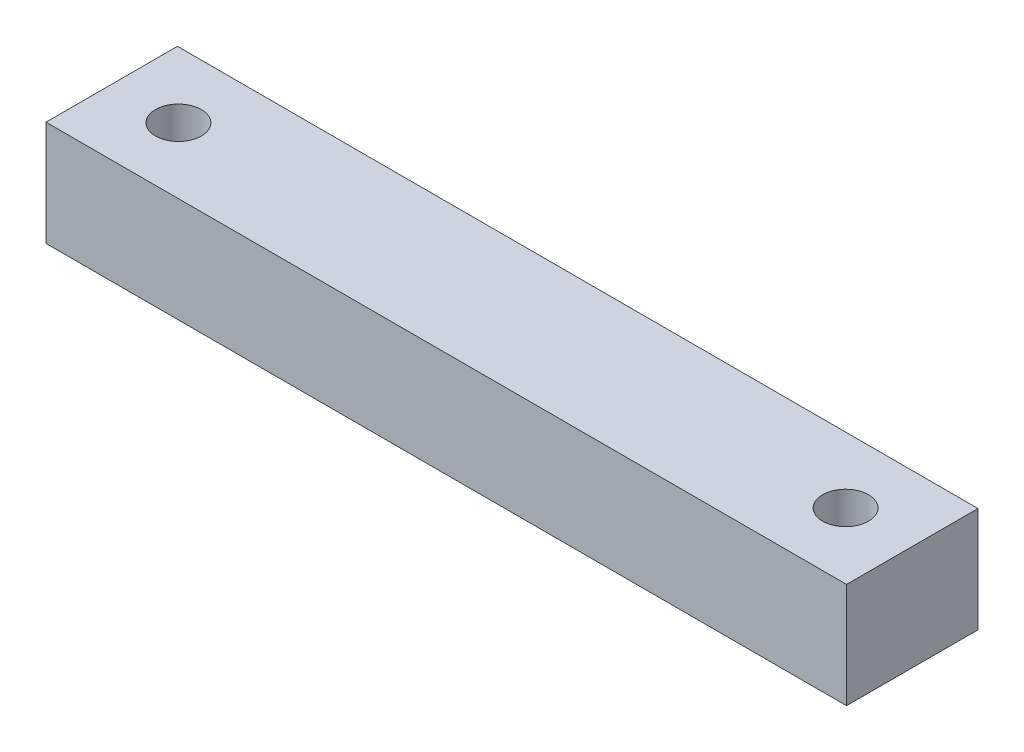
ISO-10303-21;
HEADER;
FILE_DESCRIPTION(('STEP AP214'),'2;1');
FILE_NAME('part.step','',(''),(''),'','','');
FILE_SCHEMA(('AUTOMOTIVE_DESIGN { 1 0 10303 214 1 1 1 1 }'));
ENDSEC;
DATA;
#1=APPLICATION_CONTEXT('core data for automotive mechanical design processes');
#2=APPLICATION_PROTOCOL_DEFINITION('international standard','automotive_design',2000,#1);
#3=PRODUCT_CONTEXT('',#1,'mechanical');
#4=PRODUCT('Part','Part','',(#3));
#5=PRODUCT_RELATED_PRODUCT_CATEGORY('part','',(#4));
#6=PRODUCT_DEFINITION_FORMATION('','',#4);
#7=PRODUCT_DEFINITION_CONTEXT('part definition',#1,'design');
#8=PRODUCT_DEFINITION('design','',#6,#7);
#9=PRODUCT_DEFINITION_SHAPE('','',#8);
#10=(LENGTH_UNIT() NAMED_UNIT(*) SI_UNIT(.MILLI.,.METRE.));
#11=(NAMED_UNIT(*) PLANE_ANGLE_UNIT() SI_UNIT($,.RADIAN.));
#12=(NAMED_UNIT(*) SI_UNIT($,.STERADIAN.) SOLID_ANGLE_UNIT());
#13=UNCERTAINTY_MEASURE_WITH_UNIT(LENGTH_MEASURE(1.E-05),#10,'distance_accuracy_value','');
#14=(GEOMETRIC_REPRESENTATION_CONTEXT(3) GLOBAL_UNCERTAINTY_ASSIGNED_CONTEXT((#13)) GLOBAL_UNIT_ASSIGNED_CONTEXT((#10,
#11,#12)) REPRESENTATION_CONTEXT('',''));
#15=CARTESIAN_POINT('',(0.,0.,0.));
#16=DIRECTION('',(0.,0.,1.));
#17=DIRECTION('',(1.,0.,0.));
#18=AXIS2_PLACEMENT_3D('',#15,#16,#17);
#19=CARTESIAN_POINT('',(25.4,0.,-25.019));
#20=DIRECTION('',(0.,1.,0.));
#21=DIRECTION('',(0.,0.,1.));
#22=AXIS2_PLACEMENT_3D('',#19,#20,#21);
#23=CYLINDRICAL_SURFACE('',#22,4.7625);
#24=CARTESIAN_POINT('',(25.4,0.,-25.019));
#25=DIRECTION('',(0.,1.,0.));
#26=DIRECTION('',(0.,0.,1.));
#27=AXIS2_PLACEMENT_3D('',#24,#25,#26);
#28=CIRCLE('',#27,4.7625);
#29=CARTESIAN_POINT('',(25.4,0.,-20.2565));
#30=VERTEX_POINT('',#29);
#31=EDGE_CURVE('E120',#30,#30,#28,.T.);
#32=ORIENTED_EDGE('',*,*,#31,.F.);
#33=EDGE_LOOP('',(#32));
#34=FACE_BOUND('',#33,.T.);
#35=CARTESIAN_POINT('',(25.4,24.12492,-25.019));
#36=DIRECTION('',(0.,1.,0.));
#37=DIRECTION('',(0.,0.,1.));
#38=AXIS2_PLACEMENT_3D('',#35,#36,#37);
#39=CIRCLE('',#38,4.7625);
#40=CARTESIAN_POINT('',(25.4,24.12492,-20.2565));
#41=VERTEX_POINT('',#40);
#42=EDGE_CURVE('E43',#41,#41,#39,.F.);
#43=ORIENTED_EDGE('',*,*,#42,.F.);
#44=EDGE_LOOP('',(#43));
#45=FACE_BOUND('',#44,.T.);
#46=ADVANCED_FACE('F39',(#34,#45),#23,.F.);
#47=CARTESIAN_POINT('',(279.4,0.,-25.019));
#48=DIRECTION('',(0.,1.,0.));
#49=DIRECTION('',(0.,0.,1.));
#50=AXIS2_PLACEMENT_3D('',#47,#48,#49);
#51=CYLINDRICAL_SURFACE('',#50,4.76250000000001);
#52=CARTESIAN_POINT('',(279.4,0.,-25.019));
#53=DIRECTION('',(0.,1.,0.));
#54=DIRECTION('',(0.,0.,1.));
#55=AXIS2_PLACEMENT_3D('',#52,#53,#54);
#56=CIRCLE('',#55,4.76250000000001);
#57=CARTESIAN_POINT('',(279.4,0.,-20.2565));
#58=VERTEX_POINT('',#57);
#59=EDGE_CURVE('E109',#58,#58,#56,.T.);
#60=ORIENTED_EDGE('',*,*,#59,.F.);
#61=EDGE_LOOP('',(#60));
#62=FACE_BOUND('',#61,.T.);
#63=CARTESIAN_POINT('',(279.4,24.12492,-25.019));
#64=DIRECTION('',(0.,1.,0.));
#65=DIRECTION('',(0.,0.,1.));
#66=AXIS2_PLACEMENT_3D('',#63,#64,#65);
#67=CIRCLE('',#66,4.76250000000001);
#68=CARTESIAN_POINT('',(279.4,24.12492,-20.2565));
#69=VERTEX_POINT('',#68);
#70=EDGE_CURVE('E114',#69,#69,#67,.F.);
#71=ORIENTED_EDGE('',*,*,#70,.F.);
#72=EDGE_LOOP('',(#71));
#73=FACE_BOUND('',#72,.T.);
#74=ADVANCED_FACE('F145',(#62,#73),#51,.F.);
#75=CARTESIAN_POINT('',(0.,39.99992,0.));
#76=DIRECTION('',(1.,0.,0.));
#77=DIRECTION('',(0.,0.,-1.));
#78=AXIS2_PLACEMENT_3D('',#75,#76,#77);
#79=PLANE('',#78);
#80=DIRECTION('',(0.,0.,1.));
#81=VECTOR('',#80,1.);
#82=CARTESIAN_POINT('',(0.,0.,0.));
#83=LINE('',#82,#81);
#84=CARTESIAN_POINT('',(0.,0.,-50.038));
#85=VERTEX_POINT('',#84);
#86=CARTESIAN_POINT('',(0.,0.,0.));
#87=VERTEX_POINT('',#86);
#88=EDGE_CURVE('E106',#85,#87,#83,.T.);
#89=ORIENTED_EDGE('',*,*,#88,.T.);
#90=DIRECTION('',(0.,-1.,0.));
#91=VECTOR('',#90,1.);
#92=CARTESIAN_POINT('',(0.,39.99992,0.));
#93=LINE('',#92,#91);
#94=CARTESIAN_POINT('',(0.,39.99992,0.));
#95=VERTEX_POINT('',#94);
#96=EDGE_CURVE('E11',#95,#87,#93,.T.);
#97=ORIENTED_EDGE('',*,*,#96,.F.);
#98=DIRECTION('',(0.,0.,1.));
#99=VECTOR('',#98,1.);
#100=CARTESIAN_POINT('',(0.,39.99992,0.));
#101=LINE('',#100,#99);
#102=CARTESIAN_POINT('',(0.,39.99992,-50.038));
#103=VERTEX_POINT('',#102);
#104=EDGE_CURVE('E93',#103,#95,#101,.T.);
#105=ORIENTED_EDGE('',*,*,#104,.F.);
#106=DIRECTION('',(0.,-1.,0.));
#107=VECTOR('',#106,1.);
#108=CARTESIAN_POINT('',(0.,39.99992,-50.038));
#109=LINE('',#108,#107);
#110=EDGE_CURVE('E102',#103,#85,#109,.T.);
#111=ORIENTED_EDGE('',*,*,#110,.T.);
#112=EDGE_LOOP('',(#89,#97,#105,#111));
#113=FACE_BOUND('',#112,.T.);
#114=ADVANCED_FACE('F41',(#113),#79,.F.);
#115=CARTESIAN_POINT('',(0.,39.99992,0.));
#116=DIRECTION('',(0.,0.,-1.));
#117=DIRECTION('',(-1.,0.,0.));
#118=AXIS2_PLACEMENT_3D('',#115,#116,#117);
#119=PLANE('',#118);
#120=DIRECTION('',(1.,0.,0.));
#121=VECTOR('',#120,1.);
#122=CARTESIAN_POINT('',(0.,0.,0.));
#123=LINE('',#122,#121);
#124=CARTESIAN_POINT('',(304.8,0.,0.));
#125=VERTEX_POINT('',#124);
#126=EDGE_CURVE('E97',#87,#125,#123,.T.);
#127=ORIENTED_EDGE('',*,*,#126,.T.);
#128=DIRECTION('',(0.,-1.,0.));
#129=VECTOR('',#128,1.);
#130=CARTESIAN_POINT('',(304.8,39.99992,0.));
#131=LINE('',#130,#129);
#132=CARTESIAN_POINT('',(304.8,39.99992,0.));
#133=VERTEX_POINT('',#132);
#134=EDGE_CURVE('E49',#133,#125,#131,.T.);
#135=ORIENTED_EDGE('',*,*,#134,.F.);
#136=DIRECTION('',(1.,0.,0.));
#137=VECTOR('',#136,1.);
#138=CARTESIAN_POINT('',(0.,39.99992,0.));
#139=LINE('',#138,#137);
#140=EDGE_CURVE('E88',#95,#133,#139,.T.);
#141=ORIENTED_EDGE('',*,*,#140,.F.);
#142=ORIENTED_EDGE('',*,*,#96,.T.);
#143=EDGE_LOOP('',(#127,#135,#141,#142));
#144=FACE_BOUND('',#143,.T.);
#145=ADVANCED_FACE('F96',(#144),#119,.F.);
#146=CARTESIAN_POINT('',(304.8,39.99992,0.));
#147=DIRECTION('',(-1.,0.,0.));
#148=DIRECTION('',(0.,0.,1.));
#149=AXIS2_PLACEMENT_3D('',#146,#147,#148);
#150=PLANE('',#149);
#151=DIRECTION('',(0.,0.,-1.));
#152=VECTOR('',#151,1.);
#153=CARTESIAN_POINT('',(304.8,0.,0.));
#154=LINE('',#153,#152);
#155=CARTESIAN_POINT('',(304.8,0.,-50.038));
#156=VERTEX_POINT('',#155);
#157=EDGE_CURVE('E75',#125,#156,#154,.T.);
#158=ORIENTED_EDGE('',*,*,#157,.T.);
#159=DIRECTION('',(0.,-1.,0.));
#160=VECTOR('',#159,1.);
#161=CARTESIAN_POINT('',(304.8,39.99992,-50.038));
#162=LINE('',#161,#160);
#163=CARTESIAN_POINT('',(304.8,39.99992,-50.038));
#164=VERTEX_POINT('',#163);
#165=EDGE_CURVE('E98',#164,#156,#162,.T.);
#166=ORIENTED_EDGE('',*,*,#165,.F.);
#167=DIRECTION('',(0.,0.,-1.));
#168=VECTOR('',#167,1.);
#169=CARTESIAN_POINT('',(304.8,39.99992,0.));
#170=LINE('',#169,#168);
#171=EDGE_CURVE('E91',#133,#164,#170,.T.);
#172=ORIENTED_EDGE('',*,*,#171,.F.);
#173=ORIENTED_EDGE('',*,*,#134,.T.);
#174=EDGE_LOOP('',(#158,#166,#172,#173));
#175=FACE_BOUND('',#174,.T.);
#176=ADVANCED_FACE('F100',(#175),#150,.F.);
#177=CARTESIAN_POINT('',(0.,39.99992,-50.038));
#178=DIRECTION('',(0.,0.,1.));
#179=DIRECTION('',(1.,0.,0.));
#180=AXIS2_PLACEMENT_3D('',#177,#178,#179);
#181=PLANE('',#180);
#182=DIRECTION('',(-1.,0.,0.));
#183=VECTOR('',#182,1.);
#184=CARTESIAN_POINT('',(0.,0.,-50.038));
#185=LINE('',#184,#183);
#186=EDGE_CURVE('E81',#156,#85,#185,.T.);
#187=ORIENTED_EDGE('',*,*,#186,.T.);
#188=ORIENTED_EDGE('',*,*,#110,.F.);
#189=DIRECTION('',(-1.,0.,0.));
#190=VECTOR('',#189,1.);
#191=CARTESIAN_POINT('',(0.,39.99992,-50.038));
#192=LINE('',#191,#190);
#193=EDGE_CURVE('E58',#164,#103,#192,.T.);
#194=ORIENTED_EDGE('',*,*,#193,.F.);
#195=ORIENTED_EDGE('',*,*,#165,.T.);
#196=EDGE_LOOP('',(#187,#188,#194,#195));
#197=FACE_BOUND('',#196,.T.);
#198=ADVANCED_FACE('F170',(#197),#181,.F.);
#199=CARTESIAN_POINT('',(0.,39.99992,0.));
#200=DIRECTION('',(0.,-1.,0.));
#201=DIRECTION('',(0.,0.,-1.));
#202=AXIS2_PLACEMENT_3D('',#199,#200,#201);
#203=PLANE('',#202);
#204=CARTESIAN_POINT('',(279.4,39.99992,-25.019));
#205=DIRECTION('',(0.,1.,0.));
#206=DIRECTION('',(0.,0.,1.));
#207=AXIS2_PLACEMENT_3D('',#204,#205,#206);
#208=CIRCLE('',#207,8.73759999999999);
#209=CARTESIAN_POINT('',(279.4,39.99992,-16.2814));
#210=VERTEX_POINT('',#209);
#211=EDGE_CURVE('E122',#210,#210,#208,.T.);
#212=ORIENTED_EDGE('',*,*,#211,.F.);
#213=EDGE_LOOP('',(#212));
#214=FACE_BOUND('',#213,.T.);
#215=CARTESIAN_POINT('',(25.4,39.99992,-25.019));
#216=DIRECTION('',(0.,1.,0.));
#217=DIRECTION('',(0.,0.,1.));
#218=AXIS2_PLACEMENT_3D('',#215,#216,#217);
#219=CIRCLE('',#218,8.7376);
#220=CARTESIAN_POINT('',(25.4,39.99992,-16.2814));
#221=VERTEX_POINT('',#220);
#222=EDGE_CURVE('E127',#221,#221,#219,.T.);
#223=ORIENTED_EDGE('',*,*,#222,.F.);
#224=EDGE_LOOP('',(#223));
#225=FACE_BOUND('',#224,.T.);
#226=ORIENTED_EDGE('',*,*,#104,.T.);
#227=ORIENTED_EDGE('',*,*,#140,.T.);
#228=ORIENTED_EDGE('',*,*,#171,.T.);
#229=ORIENTED_EDGE('',*,*,#193,.T.);
#230=EDGE_LOOP('',(#226,#227,#228,#229));
#231=FACE_BOUND('',#230,.T.);
#232=ADVANCED_FACE('F89',(#214,#225,#231),#203,.F.);
#233=CARTESIAN_POINT('',(0.,0.,0.));
#234=DIRECTION('',(0.,-1.,0.));
#235=DIRECTION('',(0.,0.,-1.));
#236=AXIS2_PLACEMENT_3D('',#233,#234,#235);
#237=PLANE('',#236);
#238=ORIENTED_EDGE('',*,*,#59,.T.);
#239=EDGE_LOOP('',(#238));
#240=FACE_BOUND('',#239,.T.);
#241=ORIENTED_EDGE('',*,*,#31,.T.);
#242=EDGE_LOOP('',(#241));
#243=FACE_BOUND('',#242,.T.);
#244=ORIENTED_EDGE('',*,*,#88,.F.);
#245=ORIENTED_EDGE('',*,*,#186,.F.);
#246=ORIENTED_EDGE('',*,*,#157,.F.);
#247=ORIENTED_EDGE('',*,*,#126,.F.);
#248=EDGE_LOOP('',(#244,#245,#246,#247));
#249=FACE_BOUND('',#248,.T.);
#250=ADVANCED_FACE('F140',(#240,#243,#249),#237,.T.);
#251=CARTESIAN_POINT('',(279.4,24.12492,-25.019));
#252=DIRECTION('',(0.,1.,0.));
#253=DIRECTION('',(0.,0.,1.));
#254=AXIS2_PLACEMENT_3D('',#251,#252,#253);
#255=PLANE('',#254);
#256=CARTESIAN_POINT('',(279.4,24.12492,-25.019));
#257=DIRECTION('',(0.,1.,0.));
#258=DIRECTION('',(0.,0.,1.));
#259=AXIS2_PLACEMENT_3D('',#256,#257,#258);
#260=CIRCLE('',#259,8.73759999999999);
#261=CARTESIAN_POINT('',(279.4,24.12492,-16.2814));
#262=VERTEX_POINT('',#261);
#263=EDGE_CURVE('E116',#262,#262,#260,.T.);
#264=ORIENTED_EDGE('',*,*,#263,.T.);
#265=EDGE_LOOP('',(#264));
#266=FACE_BOUND('',#265,.T.);
#267=ORIENTED_EDGE('',*,*,#70,.T.);
#268=EDGE_LOOP('',(#267));
#269=FACE_BOUND('',#268,.T.);
#270=ADVANCED_FACE('F161',(#266,#269),#255,.T.);
#271=CARTESIAN_POINT('',(279.4,24.12492,-25.019));
#272=DIRECTION('',(0.,1.,0.));
#273=DIRECTION('',(0.,0.,1.));
#274=AXIS2_PLACEMENT_3D('',#271,#272,#273);
#275=CYLINDRICAL_SURFACE('',#274,8.73759999999999);
#276=ORIENTED_EDGE('',*,*,#263,.F.);
#277=EDGE_LOOP('',(#276));
#278=FACE_BOUND('',#277,.T.);
#279=ORIENTED_EDGE('',*,*,#211,.T.);
#280=EDGE_LOOP('',(#279));
#281=FACE_BOUND('',#280,.T.);
#282=ADVANCED_FACE('F152',(#278,#281),#275,.F.);
#283=CARTESIAN_POINT('',(25.4,24.12492,-25.019));
#284=DIRECTION('',(0.,1.,0.));
#285=DIRECTION('',(0.,0.,1.));
#286=AXIS2_PLACEMENT_3D('',#283,#284,#285);
#287=PLANE('',#286);
#288=CARTESIAN_POINT('',(25.4,24.12492,-25.019));
#289=DIRECTION('',(0.,1.,0.));
#290=DIRECTION('',(0.,0.,1.));
#291=AXIS2_PLACEMENT_3D('',#288,#289,#290);
#292=CIRCLE('',#291,8.7376);
#293=CARTESIAN_POINT('',(25.4,24.12492,-16.2814));
#294=VERTEX_POINT('',#293);
#295=EDGE_CURVE('E132',#294,#294,#292,.T.);
#296=ORIENTED_EDGE('',*,*,#295,.T.);
#297=EDGE_LOOP('',(#296));
#298=FACE_BOUND('',#297,.T.);
#299=ORIENTED_EDGE('',*,*,#42,.T.);
#300=EDGE_LOOP('',(#299));
#301=FACE_BOUND('',#300,.T.);
#302=ADVANCED_FACE('F149',(#298,#301),#287,.T.);
#303=CARTESIAN_POINT('',(25.4,24.12492,-25.019));
#304=DIRECTION('',(0.,1.,0.));
#305=DIRECTION('',(0.,0.,1.));
#306=AXIS2_PLACEMENT_3D('',#303,#304,#305);
#307=CYLINDRICAL_SURFACE('',#306,8.7376);
#308=ORIENTED_EDGE('',*,*,#295,.F.);
#309=EDGE_LOOP('',(#308));
#310=FACE_BOUND('',#309,.T.);
#311=ORIENTED_EDGE('',*,*,#222,.T.);
#312=EDGE_LOOP('',(#311));
#313=FACE_BOUND('',#312,.T.);
#314=ADVANCED_FACE('F151',(#310,#313),#307,.F.);
#315=CLOSED_SHELL('',(#46,#74,#114,#145,#176,#198,#232,#250,#270,#282,#302,#314));
#316=MANIFOLD_SOLID_BREP('B2',#315);
#317=ADVANCED_BREP_SHAPE_REPRESENTATION('',(#18,#316),#14);
#318=SHAPE_DEFINITION_REPRESENTATION(#9,#317);
ENDSEC;
END-ISO-10303-21;
